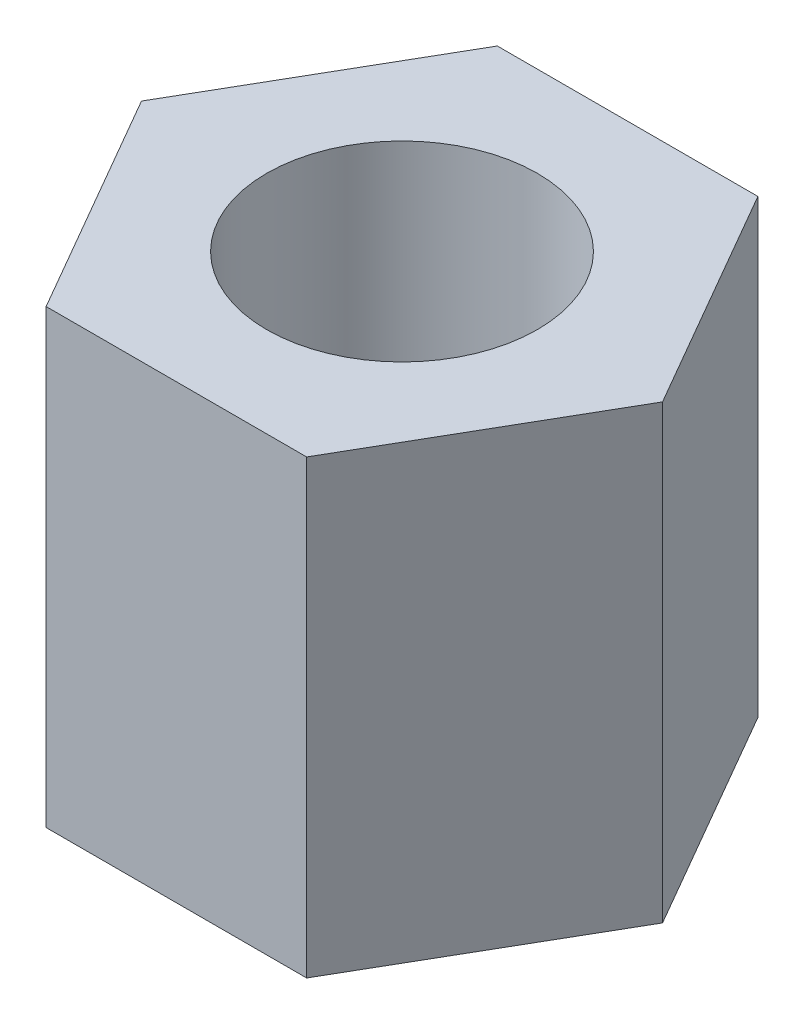
ISO-10303-21;
HEADER;
FILE_DESCRIPTION(('STEP AP214'),'2;1');
FILE_NAME('part.step','',(''),(''),'','','');
FILE_SCHEMA(('AUTOMOTIVE_DESIGN { 1 0 10303 214 1 1 1 1 }'));
ENDSEC;
DATA;
#1=APPLICATION_CONTEXT('core data for automotive mechanical design processes');
#2=APPLICATION_PROTOCOL_DEFINITION('international standard','automotive_design',2000,#1);
#3=PRODUCT_CONTEXT('',#1,'mechanical');
#4=PRODUCT('Part','Part','',(#3));
#5=PRODUCT_RELATED_PRODUCT_CATEGORY('part','',(#4));
#6=PRODUCT_DEFINITION_FORMATION('','',#4);
#7=PRODUCT_DEFINITION_CONTEXT('part definition',#1,'design');
#8=PRODUCT_DEFINITION('design','',#6,#7);
#9=PRODUCT_DEFINITION_SHAPE('','',#8);
#10=(LENGTH_UNIT() NAMED_UNIT(*) SI_UNIT(.MILLI.,.METRE.));
#11=(NAMED_UNIT(*) PLANE_ANGLE_UNIT() SI_UNIT($,.RADIAN.));
#12=(NAMED_UNIT(*) SI_UNIT($,.STERADIAN.) SOLID_ANGLE_UNIT());
#13=UNCERTAINTY_MEASURE_WITH_UNIT(LENGTH_MEASURE(1.E-05),#10,'distance_accuracy_value','');
#14=(GEOMETRIC_REPRESENTATION_CONTEXT(3) GLOBAL_UNCERTAINTY_ASSIGNED_CONTEXT((#13)) GLOBAL_UNIT_ASSIGNED_CONTEXT((#10,
#11,#12)) REPRESENTATION_CONTEXT('',''));
#15=CARTESIAN_POINT('',(0.,0.,0.));
#16=DIRECTION('',(0.,0.,1.));
#17=DIRECTION('',(1.,0.,0.));
#18=AXIS2_PLACEMENT_3D('',#15,#16,#17);
#19=CARTESIAN_POINT('',(0.,5.,5.00000000000001));
#20=DIRECTION('',(0.,-1.,0.));
#21=DIRECTION('',(0.,0.,-1.));
#22=AXIS2_PLACEMENT_3D('',#19,#20,#21);
#23=PLANE('',#22);
#24=DIRECTION('',(0.499999999999999,0.,-0.866025403784439));
#25=VECTOR('',#24,1.);
#26=CARTESIAN_POINT('',(1.44337567297406,5.,2.50000000000002));
#27=LINE('',#26,#25);
#28=CARTESIAN_POINT('',(1.44337567297406,5.,2.50000000000002));
#29=VERTEX_POINT('',#28);
#30=CARTESIAN_POINT('',(2.88675134594812,5.,0.));
#31=VERTEX_POINT('',#30);
#32=EDGE_CURVE('E130',#29,#31,#27,.T.);
#33=ORIENTED_EDGE('',*,*,#32,.T.);
#34=DIRECTION('',(-0.499999999999998,0.,-0.86602540378444));
#35=VECTOR('',#34,1.);
#36=CARTESIAN_POINT('',(2.88675134594812,5.,0.));
#37=LINE('',#36,#35);
#38=CARTESIAN_POINT('',(1.44337567297405,5.,-2.50000000000003));
#39=VERTEX_POINT('',#38);
#40=EDGE_CURVE('E88',#31,#39,#37,.T.);
#41=ORIENTED_EDGE('',*,*,#40,.T.);
#42=DIRECTION('',(-1.,0.,0.));
#43=VECTOR('',#42,1.);
#44=CARTESIAN_POINT('',(1.44337567297405,5.,-2.50000000000003));
#45=LINE('',#44,#43);
#46=CARTESIAN_POINT('',(-1.44337567297407,5.,-2.50000000000003));
#47=VERTEX_POINT('',#46);
#48=EDGE_CURVE('E101',#39,#47,#45,.T.);
#49=ORIENTED_EDGE('',*,*,#48,.T.);
#50=DIRECTION('',(-0.499999999999999,0.,0.86602540378444));
#51=VECTOR('',#50,1.);
#52=CARTESIAN_POINT('',(-1.44337567297407,5.,-2.50000000000003));
#53=LINE('',#52,#51);
#54=CARTESIAN_POINT('',(-2.88675134594815,5.,0.));
#55=VERTEX_POINT('',#54);
#56=EDGE_CURVE('E95',#47,#55,#53,.T.);
#57=ORIENTED_EDGE('',*,*,#56,.T.);
#58=DIRECTION('',(0.500000000000002,0.,0.866025403784437));
#59=VECTOR('',#58,1.);
#60=CARTESIAN_POINT('',(-2.88675134594815,5.,0.));
#61=LINE('',#60,#59);
#62=CARTESIAN_POINT('',(-1.44337567297407,5.,2.50000000000002));
#63=VERTEX_POINT('',#62);
#64=EDGE_CURVE('E99',#55,#63,#61,.T.);
#65=ORIENTED_EDGE('',*,*,#64,.T.);
#66=DIRECTION('',(1.,0.,0.));
#67=VECTOR('',#66,1.);
#68=CARTESIAN_POINT('',(-1.44337567297407,5.,2.50000000000002));
#69=LINE('',#68,#67);
#70=EDGE_CURVE('E51',#63,#29,#69,.T.);
#71=ORIENTED_EDGE('',*,*,#70,.T.);
#72=EDGE_LOOP('',(#33,#41,#49,#57,#65,#71));
#73=FACE_BOUND('',#72,.T.);
#74=CARTESIAN_POINT('',(0.,5.,0.));
#75=DIRECTION('',(0.,1.,0.));
#76=DIRECTION('',(0.,0.,1.));
#77=AXIS2_PLACEMENT_3D('',#74,#75,#76);
#78=CIRCLE('',#77,1.5);
#79=CARTESIAN_POINT('',(0.,5.,1.5));
#80=VERTEX_POINT('',#79);
#81=EDGE_CURVE('E123',#80,#80,#78,.T.);
#82=ORIENTED_EDGE('',*,*,#81,.F.);
#83=EDGE_LOOP('',(#82));
#84=FACE_BOUND('',#83,.T.);
#85=ADVANCED_FACE('F34',(#73,#84),#23,.F.);
#86=CARTESIAN_POINT('',(0.,0.,5.00000000000001));
#87=DIRECTION('',(0.,-1.,0.));
#88=DIRECTION('',(0.,0.,-1.));
#89=AXIS2_PLACEMENT_3D('',#86,#87,#88);
#90=PLANE('',#89);
#91=DIRECTION('',(0.499999999999999,0.,-0.866025403784439));
#92=VECTOR('',#91,1.);
#93=CARTESIAN_POINT('',(1.44337567297406,0.,2.50000000000002));
#94=LINE('',#93,#92);
#95=CARTESIAN_POINT('',(1.44337567297406,0.,2.50000000000002));
#96=VERTEX_POINT('',#95);
#97=CARTESIAN_POINT('',(2.88675134594812,0.,0.));
#98=VERTEX_POINT('',#97);
#99=EDGE_CURVE('E119',#96,#98,#94,.T.);
#100=ORIENTED_EDGE('',*,*,#99,.F.);
#101=DIRECTION('',(1.,0.,0.));
#102=VECTOR('',#101,1.);
#103=CARTESIAN_POINT('',(-1.44337567297407,0.,2.50000000000002));
#104=LINE('',#103,#102);
#105=CARTESIAN_POINT('',(-1.44337567297407,0.,2.50000000000002));
#106=VERTEX_POINT('',#105);
#107=EDGE_CURVE('E80',#106,#96,#104,.T.);
#108=ORIENTED_EDGE('',*,*,#107,.F.);
#109=DIRECTION('',(0.500000000000002,0.,0.866025403784437));
#110=VECTOR('',#109,1.);
#111=CARTESIAN_POINT('',(-2.88675134594815,0.,0.));
#112=LINE('',#111,#110);
#113=CARTESIAN_POINT('',(-2.88675134594815,0.,0.));
#114=VERTEX_POINT('',#113);
#115=EDGE_CURVE('E74',#114,#106,#112,.T.);
#116=ORIENTED_EDGE('',*,*,#115,.F.);
#117=DIRECTION('',(-0.499999999999999,0.,0.86602540378444));
#118=VECTOR('',#117,1.);
#119=CARTESIAN_POINT('',(-1.44337567297407,0.,-2.50000000000003));
#120=LINE('',#119,#118);
#121=CARTESIAN_POINT('',(-1.44337567297407,0.,-2.50000000000003));
#122=VERTEX_POINT('',#121);
#123=EDGE_CURVE('E109',#122,#114,#120,.T.);
#124=ORIENTED_EDGE('',*,*,#123,.F.);
#125=DIRECTION('',(-1.,0.,0.));
#126=VECTOR('',#125,1.);
#127=CARTESIAN_POINT('',(1.44337567297405,0.,-2.50000000000003));
#128=LINE('',#127,#126);
#129=CARTESIAN_POINT('',(1.44337567297405,0.,-2.50000000000003));
#130=VERTEX_POINT('',#129);
#131=EDGE_CURVE('E125',#130,#122,#128,.T.);
#132=ORIENTED_EDGE('',*,*,#131,.F.);
#133=DIRECTION('',(-0.499999999999998,0.,-0.86602540378444));
#134=VECTOR('',#133,1.);
#135=CARTESIAN_POINT('',(2.88675134594812,0.,0.));
#136=LINE('',#135,#134);
#137=EDGE_CURVE('E122',#98,#130,#136,.T.);
#138=ORIENTED_EDGE('',*,*,#137,.F.);
#139=EDGE_LOOP('',(#100,#108,#116,#124,#132,#138));
#140=FACE_BOUND('',#139,.T.);
#141=CARTESIAN_POINT('',(0.,0.,0.));
#142=DIRECTION('',(0.,1.,0.));
#143=DIRECTION('',(0.,0.,1.));
#144=AXIS2_PLACEMENT_3D('',#141,#142,#143);
#145=CIRCLE('',#144,1.5);
#146=CARTESIAN_POINT('',(0.,0.,1.5));
#147=VERTEX_POINT('',#146);
#148=EDGE_CURVE('E223',#147,#147,#145,.T.);
#149=ORIENTED_EDGE('',*,*,#148,.T.);
#150=EDGE_LOOP('',(#149));
#151=FACE_BOUND('',#150,.T.);
#152=ADVANCED_FACE('F139',(#140,#151),#90,.T.);
#153=CARTESIAN_POINT('',(1.44337567297406,5.,2.50000000000002));
#154=DIRECTION('',(-0.866025403784439,0.,-0.499999999999999));
#155=DIRECTION('',(-0.499999999999999,0.,0.866025403784439));
#156=AXIS2_PLACEMENT_3D('',#153,#154,#155);
#157=PLANE('',#156);
#158=ORIENTED_EDGE('',*,*,#99,.T.);
#159=DIRECTION('',(0.,-1.,0.));
#160=VECTOR('',#159,1.);
#161=CARTESIAN_POINT('',(2.88675134594812,5.,0.));
#162=LINE('',#161,#160);
#163=EDGE_CURVE('E11',#31,#98,#162,.T.);
#164=ORIENTED_EDGE('',*,*,#163,.F.);
#165=ORIENTED_EDGE('',*,*,#32,.F.);
#166=DIRECTION('',(0.,-1.,0.));
#167=VECTOR('',#166,1.);
#168=CARTESIAN_POINT('',(1.44337567297406,5.,2.50000000000002));
#169=LINE('',#168,#167);
#170=EDGE_CURVE('E115',#29,#96,#169,.T.);
#171=ORIENTED_EDGE('',*,*,#170,.T.);
#172=EDGE_LOOP('',(#158,#164,#165,#171));
#173=FACE_BOUND('',#172,.T.);
#174=ADVANCED_FACE('F36',(#173),#157,.F.);
#175=CARTESIAN_POINT('',(2.88675134594812,5.,0.));
#176=DIRECTION('',(-0.86602540378444,0.,0.499999999999998));
#177=DIRECTION('',(0.499999999999998,0.,0.86602540378444));
#178=AXIS2_PLACEMENT_3D('',#175,#176,#177);
#179=PLANE('',#178);
#180=ORIENTED_EDGE('',*,*,#137,.T.);
#181=DIRECTION('',(0.,-1.,0.));
#182=VECTOR('',#181,1.);
#183=CARTESIAN_POINT('',(1.44337567297405,5.,-2.50000000000003));
#184=LINE('',#183,#182);
#185=EDGE_CURVE('E43',#39,#130,#184,.T.);
#186=ORIENTED_EDGE('',*,*,#185,.F.);
#187=ORIENTED_EDGE('',*,*,#40,.F.);
#188=ORIENTED_EDGE('',*,*,#163,.T.);
#189=EDGE_LOOP('',(#180,#186,#187,#188));
#190=FACE_BOUND('',#189,.T.);
#191=ADVANCED_FACE('F164',(#190),#179,.F.);
#192=CARTESIAN_POINT('',(1.44337567297405,5.,-2.50000000000003));
#193=DIRECTION('',(0.,0.,1.));
#194=DIRECTION('',(1.,0.,0.));
#195=AXIS2_PLACEMENT_3D('',#192,#193,#194);
#196=PLANE('',#195);
#197=ORIENTED_EDGE('',*,*,#131,.T.);
#198=DIRECTION('',(0.,-1.,0.));
#199=VECTOR('',#198,1.);
#200=CARTESIAN_POINT('',(-1.44337567297407,5.,-2.50000000000003));
#201=LINE('',#200,#199);
#202=EDGE_CURVE('E110',#47,#122,#201,.T.);
#203=ORIENTED_EDGE('',*,*,#202,.F.);
#204=ORIENTED_EDGE('',*,*,#48,.F.);
#205=ORIENTED_EDGE('',*,*,#185,.T.);
#206=EDGE_LOOP('',(#197,#203,#204,#205));
#207=FACE_BOUND('',#206,.T.);
#208=ADVANCED_FACE('F136',(#207),#196,.F.);
#209=CARTESIAN_POINT('',(-1.44337567297407,5.,-2.50000000000003));
#210=DIRECTION('',(0.86602540378444,0.,0.499999999999998));
#211=DIRECTION('',(0.499999999999998,0.,-0.86602540378444));
#212=AXIS2_PLACEMENT_3D('',#209,#210,#211);
#213=PLANE('',#212);
#214=ORIENTED_EDGE('',*,*,#123,.T.);
#215=DIRECTION('',(0.,-1.,0.));
#216=VECTOR('',#215,1.);
#217=CARTESIAN_POINT('',(-2.88675134594815,5.,0.));
#218=LINE('',#217,#216);
#219=EDGE_CURVE('E106',#55,#114,#218,.T.);
#220=ORIENTED_EDGE('',*,*,#219,.F.);
#221=ORIENTED_EDGE('',*,*,#56,.F.);
#222=ORIENTED_EDGE('',*,*,#202,.T.);
#223=EDGE_LOOP('',(#214,#220,#221,#222));
#224=FACE_BOUND('',#223,.T.);
#225=ADVANCED_FACE('F107',(#224),#213,.F.);
#226=CARTESIAN_POINT('',(-2.88675134594815,5.,0.));
#227=DIRECTION('',(0.866025403784437,0.,-0.500000000000002));
#228=DIRECTION('',(-0.500000000000002,0.,-0.866025403784437));
#229=AXIS2_PLACEMENT_3D('',#226,#227,#228);
#230=PLANE('',#229);
#231=ORIENTED_EDGE('',*,*,#115,.T.);
#232=DIRECTION('',(0.,-1.,0.));
#233=VECTOR('',#232,1.);
#234=CARTESIAN_POINT('',(-1.44337567297407,5.,2.50000000000002));
#235=LINE('',#234,#233);
#236=EDGE_CURVE('E111',#63,#106,#235,.T.);
#237=ORIENTED_EDGE('',*,*,#236,.F.);
#238=ORIENTED_EDGE('',*,*,#64,.F.);
#239=ORIENTED_EDGE('',*,*,#219,.T.);
#240=EDGE_LOOP('',(#231,#237,#238,#239));
#241=FACE_BOUND('',#240,.T.);
#242=ADVANCED_FACE('F113',(#241),#230,.F.);
#243=CARTESIAN_POINT('',(-1.44337567297407,5.,2.50000000000002));
#244=DIRECTION('',(0.,0.,-1.));
#245=DIRECTION('',(-1.,0.,0.));
#246=AXIS2_PLACEMENT_3D('',#243,#244,#245);
#247=PLANE('',#246);
#248=ORIENTED_EDGE('',*,*,#107,.T.);
#249=ORIENTED_EDGE('',*,*,#170,.F.);
#250=ORIENTED_EDGE('',*,*,#70,.F.);
#251=ORIENTED_EDGE('',*,*,#236,.T.);
#252=EDGE_LOOP('',(#248,#249,#250,#251));
#253=FACE_BOUND('',#252,.T.);
#254=ADVANCED_FACE('F144',(#253),#247,.F.);
#255=CARTESIAN_POINT('',(0.,5.,0.));
#256=DIRECTION('',(0.,-1.,0.));
#257=DIRECTION('',(0.,0.,-1.));
#258=AXIS2_PLACEMENT_3D('',#255,#256,#257);
#259=CYLINDRICAL_SURFACE('',#258,1.5);
#260=ORIENTED_EDGE('',*,*,#81,.T.);
#261=EDGE_LOOP('',(#260));
#262=FACE_BOUND('',#261,.T.);
#263=ORIENTED_EDGE('',*,*,#148,.F.);
#264=EDGE_LOOP('',(#263));
#265=FACE_BOUND('',#264,.T.);
#266=ADVANCED_FACE('F146',(#262,#265),#259,.F.);
#267=CLOSED_SHELL('',(#85,#152,#174,#191,#208,#225,#242,#254,#266));
#268=MANIFOLD_SOLID_BREP('B2',#267);
#269=ADVANCED_BREP_SHAPE_REPRESENTATION('',(#18,#268),#14);
#270=SHAPE_DEFINITION_REPRESENTATION(#9,#269);
ENDSEC;
END-ISO-10303-21;
